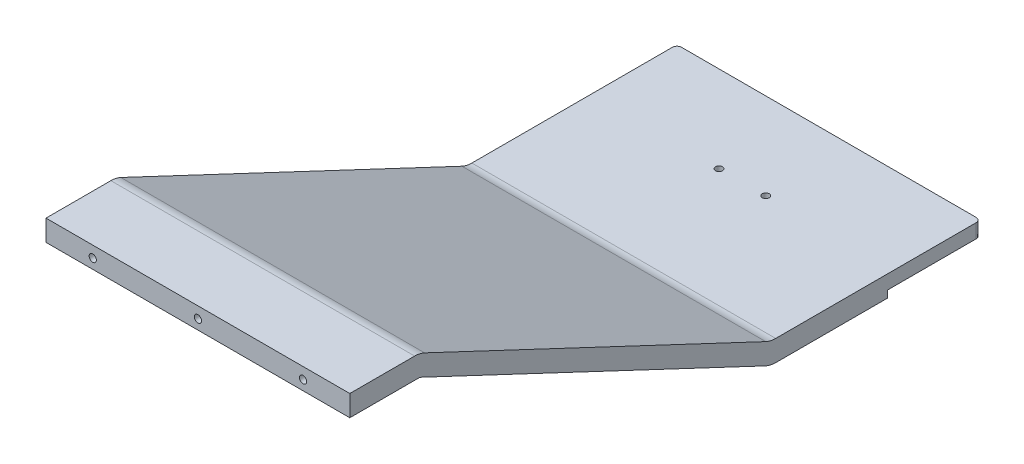
ISO-10303-21;
HEADER;
FILE_DESCRIPTION(('STEP AP214'),'2;1');
FILE_NAME('part.step','',(''),(''),'','','');
FILE_SCHEMA(('AUTOMOTIVE_DESIGN { 1 0 10303 214 1 1 1 1 }'));
ENDSEC;
DATA;
#1=APPLICATION_CONTEXT('core data for automotive mechanical design processes');
#2=APPLICATION_PROTOCOL_DEFINITION('international standard','automotive_design',2000,#1);
#3=PRODUCT_CONTEXT('',#1,'mechanical');
#4=PRODUCT('Part','Part','',(#3));
#5=PRODUCT_RELATED_PRODUCT_CATEGORY('part','',(#4));
#6=PRODUCT_DEFINITION_FORMATION('','',#4);
#7=PRODUCT_DEFINITION_CONTEXT('part definition',#1,'design');
#8=PRODUCT_DEFINITION('design','',#6,#7);
#9=PRODUCT_DEFINITION_SHAPE('','',#8);
#10=(LENGTH_UNIT() NAMED_UNIT(*) SI_UNIT(.MILLI.,.METRE.));
#11=(NAMED_UNIT(*) PLANE_ANGLE_UNIT() SI_UNIT($,.RADIAN.));
#12=(NAMED_UNIT(*) SI_UNIT($,.STERADIAN.) SOLID_ANGLE_UNIT());
#13=UNCERTAINTY_MEASURE_WITH_UNIT(LENGTH_MEASURE(1.E-05),#10,'distance_accuracy_value','');
#14=(GEOMETRIC_REPRESENTATION_CONTEXT(3) GLOBAL_UNCERTAINTY_ASSIGNED_CONTEXT((#13)) GLOBAL_UNIT_ASSIGNED_CONTEXT((#10,
#11,#12)) REPRESENTATION_CONTEXT('',''));
#15=CARTESIAN_POINT('',(0.,0.,0.));
#16=DIRECTION('',(0.,0.,1.));
#17=DIRECTION('',(1.,0.,0.));
#18=AXIS2_PLACEMENT_3D('',#15,#16,#17);
#19=CARTESIAN_POINT('',(209.,70.,-50.));
#20=DIRECTION('',(0.,0.,1.));
#21=DIRECTION('',(1.,0.,0.));
#22=AXIS2_PLACEMENT_3D('',#19,#20,#21);
#23=PLANE('',#22);
#24=DIRECTION('',(0.,1.,0.));
#25=VECTOR('',#24,1.);
#26=CARTESIAN_POINT('',(79.,70.,-50.));
#27=LINE('',#26,#25);
#28=CARTESIAN_POINT('',(79.,70.,-50.));
#29=VERTEX_POINT('',#28);
#30=CARTESIAN_POINT('',(79.,73.,-50.));
#31=VERTEX_POINT('',#30);
#32=EDGE_CURVE('E190',#29,#31,#27,.T.);
#33=ORIENTED_EDGE('',*,*,#32,.T.);
#34=DIRECTION('',(-1.,0.,0.));
#35=VECTOR('',#34,1.);
#36=CARTESIAN_POINT('',(209.,73.,-50.));
#37=LINE('',#36,#35);
#38=CARTESIAN_POINT('',(209.,73.,-50.));
#39=VERTEX_POINT('',#38);
#40=EDGE_CURVE('E252',#39,#31,#37,.T.);
#41=ORIENTED_EDGE('',*,*,#40,.F.);
#42=DIRECTION('',(0.,1.,0.));
#43=VECTOR('',#42,1.);
#44=CARTESIAN_POINT('',(209.,70.,-50.));
#45=LINE('',#44,#43);
#46=CARTESIAN_POINT('',(209.,70.,-50.));
#47=VERTEX_POINT('',#46);
#48=EDGE_CURVE('E197',#47,#39,#45,.T.);
#49=ORIENTED_EDGE('',*,*,#48,.F.);
#50=DIRECTION('',(-1.,0.,0.));
#51=VECTOR('',#50,1.);
#52=CARTESIAN_POINT('',(209.,70.,-50.));
#53=LINE('',#52,#51);
#54=EDGE_CURVE('E214',#47,#29,#53,.T.);
#55=ORIENTED_EDGE('',*,*,#54,.T.);
#56=EDGE_LOOP('',(#33,#41,#49,#55));
#57=FACE_BOUND('',#56,.T.);
#58=ADVANCED_FACE('F57',(#57),#23,.F.);
#59=CARTESIAN_POINT('',(209.,73.,-50.));
#60=DIRECTION('',(0.,1.,0.));
#61=DIRECTION('',(0.,0.,1.));
#62=AXIS2_PLACEMENT_3D('',#59,#60,#61);
#63=PLANE('',#62);
#64=CARTESIAN_POINT('',(134.,73.,-53.));
#65=DIRECTION('',(0.,-1.,0.));
#66=DIRECTION('',(0.,0.,-1.));
#67=AXIS2_PLACEMENT_3D('',#64,#65,#66);
#68=CIRCLE('',#67,1.5);
#69=CARTESIAN_POINT('',(134.,73.,-54.5));
#70=VERTEX_POINT('',#69);
#71=EDGE_CURVE('E278',#70,#70,#68,.T.);
#72=ORIENTED_EDGE('',*,*,#71,.F.);
#73=EDGE_LOOP('',(#72));
#74=FACE_BOUND('',#73,.T.);
#75=CARTESIAN_POINT('',(154.,73.,-53.));
#76=DIRECTION('',(0.,-1.,0.));
#77=DIRECTION('',(0.,0.,-1.));
#78=AXIS2_PLACEMENT_3D('',#75,#76,#77);
#79=CIRCLE('',#78,1.5);
#80=CARTESIAN_POINT('',(154.,73.,-54.5));
#81=VERTEX_POINT('',#80);
#82=EDGE_CURVE('E557',#81,#81,#79,.T.);
#83=ORIENTED_EDGE('',*,*,#82,.F.);
#84=EDGE_LOOP('',(#83));
#85=FACE_BOUND('',#84,.T.);
#86=DIRECTION('',(-1.,0.,0.));
#87=VECTOR('',#86,1.);
#88=CARTESIAN_POINT('',(209.,73.,-90.));
#89=LINE('',#88,#87);
#90=CARTESIAN_POINT('',(207.,73.,-90.));
#91=VERTEX_POINT('',#90);
#92=CARTESIAN_POINT('',(81.,73.,-90.));
#93=VERTEX_POINT('',#92);
#94=EDGE_CURVE('E247',#91,#93,#89,.T.);
#95=ORIENTED_EDGE('',*,*,#94,.F.);
#96=CARTESIAN_POINT('',(207.,73.,-88.));
#97=DIRECTION('',(0.,1.,0.));
#98=DIRECTION('',(0.,0.,1.));
#99=AXIS2_PLACEMENT_3D('',#96,#97,#98);
#100=CIRCLE('',#99,2.);
#101=CARTESIAN_POINT('',(209.,73.,-88.));
#102=VERTEX_POINT('',#101);
#103=EDGE_CURVE('E266',#91,#102,#100,.F.);
#104=ORIENTED_EDGE('',*,*,#103,.T.);
#105=DIRECTION('',(0.,0.,-1.));
#106=VECTOR('',#105,1.);
#107=CARTESIAN_POINT('',(209.,73.,-50.));
#108=LINE('',#107,#106);
#109=EDGE_CURVE('E199',#39,#102,#108,.T.);
#110=ORIENTED_EDGE('',*,*,#109,.F.);
#111=ORIENTED_EDGE('',*,*,#40,.T.);
#112=DIRECTION('',(0.,0.,-1.));
#113=VECTOR('',#112,1.);
#114=CARTESIAN_POINT('',(79.,73.,-50.));
#115=LINE('',#114,#113);
#116=CARTESIAN_POINT('',(79.,73.,-88.));
#117=VERTEX_POINT('',#116);
#118=EDGE_CURVE('E188',#31,#117,#115,.T.);
#119=ORIENTED_EDGE('',*,*,#118,.T.);
#120=CARTESIAN_POINT('',(81.,73.,-88.));
#121=DIRECTION('',(0.,1.,0.));
#122=DIRECTION('',(0.,0.,1.));
#123=AXIS2_PLACEMENT_3D('',#120,#121,#122);
#124=CIRCLE('',#123,2.);
#125=EDGE_CURVE('E268',#117,#93,#124,.F.);
#126=ORIENTED_EDGE('',*,*,#125,.T.);
#127=EDGE_LOOP('',(#95,#104,#110,#111,#119,#126));
#128=FACE_BOUND('',#127,.T.);
#129=ADVANCED_FACE('F321',(#74,#85,#128),#63,.F.);
#130=CARTESIAN_POINT('',(209.,73.,-90.));
#131=DIRECTION('',(0.,0.,1.));
#132=DIRECTION('',(1.,0.,0.));
#133=AXIS2_PLACEMENT_3D('',#130,#131,#132);
#134=PLANE('',#133);
#135=DIRECTION('',(-1.,0.,0.));
#136=VECTOR('',#135,1.);
#137=CARTESIAN_POINT('',(209.,79.,-90.));
#138=LINE('',#137,#136);
#139=CARTESIAN_POINT('',(207.,79.,-90.));
#140=VERTEX_POINT('',#139);
#141=CARTESIAN_POINT('',(81.,79.,-90.));
#142=VERTEX_POINT('',#141);
#143=EDGE_CURVE('E244',#140,#142,#138,.T.);
#144=ORIENTED_EDGE('',*,*,#143,.F.);
#145=DIRECTION('',(0.,1.,0.));
#146=VECTOR('',#145,1.);
#147=CARTESIAN_POINT('',(207.,73.,-90.));
#148=LINE('',#147,#146);
#149=EDGE_CURVE('E264',#140,#91,#148,.F.);
#150=ORIENTED_EDGE('',*,*,#149,.T.);
#151=ORIENTED_EDGE('',*,*,#94,.T.);
#152=DIRECTION('',(0.,1.,0.));
#153=VECTOR('',#152,1.);
#154=CARTESIAN_POINT('',(81.,73.,-90.));
#155=LINE('',#154,#153);
#156=EDGE_CURVE('E262',#93,#142,#155,.T.);
#157=ORIENTED_EDGE('',*,*,#156,.T.);
#158=EDGE_LOOP('',(#144,#150,#151,#157));
#159=FACE_BOUND('',#158,.T.);
#160=ADVANCED_FACE('F357',(#159),#134,.F.);
#161=CARTESIAN_POINT('',(209.,79.,-90.));
#162=DIRECTION('',(0.,-1.,0.));
#163=DIRECTION('',(0.,0.,-1.));
#164=AXIS2_PLACEMENT_3D('',#161,#162,#163);
#165=PLANE('',#164);
#166=CARTESIAN_POINT('',(134.,79.,-53.));
#167=DIRECTION('',(0.,-1.,0.));
#168=DIRECTION('',(0.,0.,-1.));
#169=AXIS2_PLACEMENT_3D('',#166,#167,#168);
#170=CIRCLE('',#169,1.5);
#171=CARTESIAN_POINT('',(134.,79.,-54.5));
#172=VERTEX_POINT('',#171);
#173=EDGE_CURVE('E273',#172,#172,#170,.T.);
#174=ORIENTED_EDGE('',*,*,#173,.T.);
#175=EDGE_LOOP('',(#174));
#176=FACE_BOUND('',#175,.T.);
#177=CARTESIAN_POINT('',(154.,79.,-53.));
#178=DIRECTION('',(0.,-1.,0.));
#179=DIRECTION('',(0.,0.,-1.));
#180=AXIS2_PLACEMENT_3D('',#177,#178,#179);
#181=CIRCLE('',#180,1.5);
#182=CARTESIAN_POINT('',(154.,79.,-54.5));
#183=VERTEX_POINT('',#182);
#184=EDGE_CURVE('E275',#183,#183,#181,.T.);
#185=ORIENTED_EDGE('',*,*,#184,.T.);
#186=EDGE_LOOP('',(#185));
#187=FACE_BOUND('',#186,.T.);
#188=DIRECTION('',(0.,0.,1.));
#189=VECTOR('',#188,1.);
#190=CARTESIAN_POINT('',(209.,79.,-90.));
#191=LINE('',#190,#189);
#192=CARTESIAN_POINT('',(209.,79.,-88.));
#193=VERTEX_POINT('',#192);
#194=CARTESIAN_POINT('',(209.,79.,-2.23887536352073));
#195=VERTEX_POINT('',#194);
#196=EDGE_CURVE('E201',#193,#195,#191,.T.);
#197=ORIENTED_EDGE('',*,*,#196,.F.);
#198=CARTESIAN_POINT('',(207.,79.,-88.));
#199=DIRECTION('',(0.,-1.,0.));
#200=DIRECTION('',(0.,0.,-1.));
#201=AXIS2_PLACEMENT_3D('',#198,#199,#200);
#202=CIRCLE('',#201,2.);
#203=EDGE_CURVE('E259',#193,#140,#202,.F.);
#204=ORIENTED_EDGE('',*,*,#203,.T.);
#205=ORIENTED_EDGE('',*,*,#143,.T.);
#206=CARTESIAN_POINT('',(81.,79.,-88.));
#207=DIRECTION('',(0.,-1.,0.));
#208=DIRECTION('',(0.,0.,-1.));
#209=AXIS2_PLACEMENT_3D('',#206,#207,#208);
#210=CIRCLE('',#209,2.);
#211=CARTESIAN_POINT('',(79.,79.,-88.));
#212=VERTEX_POINT('',#211);
#213=EDGE_CURVE('E260',#142,#212,#210,.F.);
#214=ORIENTED_EDGE('',*,*,#213,.T.);
#215=DIRECTION('',(0.,0.,1.));
#216=VECTOR('',#215,1.);
#217=CARTESIAN_POINT('',(79.,79.,-90.));
#218=LINE('',#217,#216);
#219=CARTESIAN_POINT('',(79.,79.,-2.23887536352073));
#220=VERTEX_POINT('',#219);
#221=EDGE_CURVE('E218',#212,#220,#218,.T.);
#222=ORIENTED_EDGE('',*,*,#221,.T.);
#223=DIRECTION('',(-1.,0.,0.));
#224=VECTOR('',#223,1.);
#225=CARTESIAN_POINT('',(209.,79.,-2.23887536352073));
#226=LINE('',#225,#224);
#227=EDGE_CURVE('E245',#195,#220,#226,.T.);
#228=ORIENTED_EDGE('',*,*,#227,.F.);
#229=EDGE_LOOP('',(#197,#204,#205,#214,#222,#228));
#230=FACE_BOUND('',#229,.T.);
#231=ADVANCED_FACE('F335',(#176,#187,#230),#165,.F.);
#232=CARTESIAN_POINT('',(209.,89.,-2.23887536352073));
#233=DIRECTION('',(-1.,0.,0.));
#234=DIRECTION('',(0.,0.,1.));
#235=AXIS2_PLACEMENT_3D('',#232,#233,#234);
#236=CYLINDRICAL_SURFACE('',#235,10.);
#237=CARTESIAN_POINT('',(79.,89.,-2.23887536352073));
#238=DIRECTION('',(-1.,0.,0.));
#239=DIRECTION('',(0.,0.,-1.));
#240=AXIS2_PLACEMENT_3D('',#237,#238,#239);
#241=CIRCLE('',#240,10.);
#242=CARTESIAN_POINT('',(79.,79.9546596626671,2.02513896359148));
#243=VERTEX_POINT('',#242);
#244=EDGE_CURVE('E216',#220,#243,#241,.T.);
#245=ORIENTED_EDGE('',*,*,#244,.T.);
#246=DIRECTION('',(-1.,0.,0.));
#247=VECTOR('',#246,1.);
#248=CARTESIAN_POINT('',(209.,79.9546596626671,2.02513896359148));
#249=LINE('',#248,#247);
#250=CARTESIAN_POINT('',(209.,79.9546596626671,2.02513896359148));
#251=VERTEX_POINT('',#250);
#252=EDGE_CURVE('E237',#251,#243,#249,.T.);
#253=ORIENTED_EDGE('',*,*,#252,.F.);
#254=CARTESIAN_POINT('',(209.,89.,-2.23887536352073));
#255=DIRECTION('',(-1.,0.,0.));
#256=DIRECTION('',(0.,0.,-1.));
#257=AXIS2_PLACEMENT_3D('',#254,#255,#256);
#258=CIRCLE('',#257,10.);
#259=EDGE_CURVE('E202',#195,#251,#258,.T.);
#260=ORIENTED_EDGE('',*,*,#259,.F.);
#261=ORIENTED_EDGE('',*,*,#227,.T.);
#262=EDGE_LOOP('',(#245,#253,#260,#261));
#263=FACE_BOUND('',#262,.T.);
#264=ADVANCED_FACE('F339',(#263),#236,.F.);
#265=CARTESIAN_POINT('',(209.,79.9546596626671,2.02513896359148));
#266=DIRECTION('',(0.,-0.904534033733291,0.42640143271122));
#267=DIRECTION('',(0.,-0.42640143271122,-0.904534033733291));
#268=AXIS2_PLACEMENT_3D('',#265,#266,#267);
#269=PLANE('',#268);
#270=DIRECTION('',(0.,0.42640143271122,0.904534033733291));
#271=VECTOR('',#270,1.);
#272=CARTESIAN_POINT('',(79.,79.9546596626671,2.02513896359148));
#273=LINE('',#272,#271);
#274=CARTESIAN_POINT('',(79.,148.756018455988,147.974861036408));
#275=VERTEX_POINT('',#274);
#276=EDGE_CURVE('E225',#243,#275,#273,.T.);
#277=ORIENTED_EDGE('',*,*,#276,.T.);
#278=DIRECTION('',(-1.,0.,0.));
#279=VECTOR('',#278,1.);
#280=CARTESIAN_POINT('',(209.,148.756018455988,147.974861036408));
#281=LINE('',#280,#279);
#282=CARTESIAN_POINT('',(209.,148.756018455988,147.974861036408));
#283=VERTEX_POINT('',#282);
#284=EDGE_CURVE('E64',#275,#283,#281,.F.);
#285=ORIENTED_EDGE('',*,*,#284,.T.);
#286=DIRECTION('',(0.,0.42640143271122,0.904534033733291));
#287=VECTOR('',#286,1.);
#288=CARTESIAN_POINT('',(209.,79.9546596626671,2.02513896359148));
#289=LINE('',#288,#287);
#290=EDGE_CURVE('E210',#251,#283,#289,.T.);
#291=ORIENTED_EDGE('',*,*,#290,.F.);
#292=ORIENTED_EDGE('',*,*,#252,.T.);
#293=EDGE_LOOP('',(#277,#285,#291,#292));
#294=FACE_BOUND('',#293,.T.);
#295=ADVANCED_FACE('F374',(#294),#269,.F.);
#296=CARTESIAN_POINT('',(209.,140.710678118655,150.));
#297=DIRECTION('',(0.,0.904534033733291,-0.42640143271122));
#298=DIRECTION('',(0.,0.42640143271122,0.904534033733291));
#299=AXIS2_PLACEMENT_3D('',#296,#297,#298);
#300=PLANE('',#299);
#301=DIRECTION('',(0.,-0.42640143271122,-0.904534033733291));
#302=VECTOR('',#301,1.);
#303=CARTESIAN_POINT('',(79.,140.710678118655,150.));
#304=LINE('',#303,#302);
#305=CARTESIAN_POINT('',(79.,140.710678118655,150.));
#306=VERTEX_POINT('',#305);
#307=CARTESIAN_POINT('',(79.,70.9546596626671,2.02513896359148));
#308=VERTEX_POINT('',#307);
#309=EDGE_CURVE('E223',#306,#308,#304,.T.);
#310=ORIENTED_EDGE('',*,*,#309,.T.);
#311=DIRECTION('',(-1.,0.,0.));
#312=VECTOR('',#311,1.);
#313=CARTESIAN_POINT('',(209.,70.9546596626671,2.02513896359148));
#314=LINE('',#313,#312);
#315=CARTESIAN_POINT('',(209.,70.9546596626671,2.02513896359148));
#316=VERTEX_POINT('',#315);
#317=EDGE_CURVE('E234',#316,#308,#314,.T.);
#318=ORIENTED_EDGE('',*,*,#317,.F.);
#319=DIRECTION('',(0.,-0.42640143271122,-0.904534033733291));
#320=VECTOR('',#319,1.);
#321=CARTESIAN_POINT('',(209.,140.710678118655,150.));
#322=LINE('',#321,#320);
#323=CARTESIAN_POINT('',(209.,140.710678118655,150.));
#324=VERTEX_POINT('',#323);
#325=EDGE_CURVE('E209',#324,#316,#322,.T.);
#326=ORIENTED_EDGE('',*,*,#325,.F.);
#327=DIRECTION('',(-1.,0.,0.));
#328=VECTOR('',#327,1.);
#329=CARTESIAN_POINT('',(209.,140.710678118655,150.));
#330=LINE('',#329,#328);
#331=EDGE_CURVE('E240',#324,#306,#330,.T.);
#332=ORIENTED_EDGE('',*,*,#331,.T.);
#333=EDGE_LOOP('',(#310,#318,#326,#332));
#334=FACE_BOUND('',#333,.T.);
#335=ADVANCED_FACE('F304',(#334),#300,.F.);
#336=CARTESIAN_POINT('',(209.,80.,-2.23887536352072));
#337=DIRECTION('',(-1.,0.,0.));
#338=DIRECTION('',(0.,0.,1.));
#339=AXIS2_PLACEMENT_3D('',#336,#337,#338);
#340=CYLINDRICAL_SURFACE('',#339,9.99999999999999);
#341=CARTESIAN_POINT('',(79.,80.,-2.23887536352072));
#342=DIRECTION('',(1.,0.,0.));
#343=DIRECTION('',(0.,0.,-1.));
#344=AXIS2_PLACEMENT_3D('',#341,#342,#343);
#345=CIRCLE('',#344,9.99999999999999);
#346=CARTESIAN_POINT('',(79.,70.,-2.23887536352072));
#347=VERTEX_POINT('',#346);
#348=EDGE_CURVE('E228',#308,#347,#345,.T.);
#349=ORIENTED_EDGE('',*,*,#348,.T.);
#350=DIRECTION('',(-1.,0.,0.));
#351=VECTOR('',#350,1.);
#352=CARTESIAN_POINT('',(209.,70.,-2.23887536352072));
#353=LINE('',#352,#351);
#354=CARTESIAN_POINT('',(209.,70.,-2.23887536352072));
#355=VERTEX_POINT('',#354);
#356=EDGE_CURVE('E233',#355,#347,#353,.T.);
#357=ORIENTED_EDGE('',*,*,#356,.F.);
#358=CARTESIAN_POINT('',(209.,80.,-2.23887536352072));
#359=DIRECTION('',(1.,0.,0.));
#360=DIRECTION('',(0.,0.,-1.));
#361=AXIS2_PLACEMENT_3D('',#358,#359,#360);
#362=CIRCLE('',#361,9.99999999999999);
#363=EDGE_CURVE('E213',#316,#355,#362,.T.);
#364=ORIENTED_EDGE('',*,*,#363,.F.);
#365=ORIENTED_EDGE('',*,*,#317,.T.);
#366=EDGE_LOOP('',(#349,#357,#364,#365));
#367=FACE_BOUND('',#366,.T.);
#368=ADVANCED_FACE('F311',(#367),#340,.T.);
#369=CARTESIAN_POINT('',(209.,70.,-2.23887536352072));
#370=DIRECTION('',(0.,1.,0.));
#371=DIRECTION('',(0.,0.,1.));
#372=AXIS2_PLACEMENT_3D('',#369,#370,#371);
#373=PLANE('',#372);
#374=DIRECTION('',(0.,0.,-1.));
#375=VECTOR('',#374,1.);
#376=CARTESIAN_POINT('',(79.,70.,-2.23887536352072));
#377=LINE('',#376,#375);
#378=EDGE_CURVE('E196',#347,#29,#377,.T.);
#379=ORIENTED_EDGE('',*,*,#378,.T.);
#380=ORIENTED_EDGE('',*,*,#54,.F.);
#381=DIRECTION('',(0.,0.,-1.));
#382=VECTOR('',#381,1.);
#383=CARTESIAN_POINT('',(209.,70.,-2.23887536352072));
#384=LINE('',#383,#382);
#385=EDGE_CURVE('E211',#355,#47,#384,.T.);
#386=ORIENTED_EDGE('',*,*,#385,.F.);
#387=ORIENTED_EDGE('',*,*,#356,.T.);
#388=EDGE_LOOP('',(#379,#380,#386,#387));
#389=FACE_BOUND('',#388,.T.);
#390=ADVANCED_FACE('F314',(#389),#373,.F.);
#391=CARTESIAN_POINT('',(209.,89.,-2.23887536352073));
#392=DIRECTION('',(1.,0.,0.));
#393=DIRECTION('',(0.,0.,-1.));
#394=AXIS2_PLACEMENT_3D('',#391,#392,#393);
#395=PLANE('',#394);
#396=ORIENTED_EDGE('',*,*,#290,.T.);
#397=CARTESIAN_POINT('',(209.,139.710678118655,152.238875363521));
#398=DIRECTION('',(1.,0.,0.));
#399=DIRECTION('',(0.,0.,-1.));
#400=AXIS2_PLACEMENT_3D('',#397,#398,#399);
#401=CIRCLE('',#400,10.);
#402=CARTESIAN_POINT('',(209.,149.710678118655,152.238875363521));
#403=VERTEX_POINT('',#402);
#404=EDGE_CURVE('E12',#283,#403,#401,.T.);
#405=ORIENTED_EDGE('',*,*,#404,.T.);
#406=DIRECTION('',(0.,0.,-1.));
#407=VECTOR('',#406,1.);
#408=CARTESIAN_POINT('',(209.,149.710678118655,180.));
#409=LINE('',#408,#407);
#410=CARTESIAN_POINT('',(209.,149.710678118655,180.));
#411=VERTEX_POINT('',#410);
#412=EDGE_CURVE('E294',#411,#403,#409,.T.);
#413=ORIENTED_EDGE('',*,*,#412,.F.);
#414=DIRECTION('',(0.,1.,0.));
#415=VECTOR('',#414,1.);
#416=CARTESIAN_POINT('',(209.,140.710678118655,180.));
#417=LINE('',#416,#415);
#418=CARTESIAN_POINT('',(209.,140.710678118655,180.));
#419=VERTEX_POINT('',#418);
#420=EDGE_CURVE('E180',#419,#411,#417,.T.);
#421=ORIENTED_EDGE('',*,*,#420,.F.);
#422=DIRECTION('',(0.,0.,-1.));
#423=VECTOR('',#422,1.);
#424=CARTESIAN_POINT('',(209.,140.710678118655,180.));
#425=LINE('',#424,#423);
#426=EDGE_CURVE('E195',#419,#324,#425,.T.);
#427=ORIENTED_EDGE('',*,*,#426,.T.);
#428=ORIENTED_EDGE('',*,*,#325,.T.);
#429=ORIENTED_EDGE('',*,*,#363,.T.);
#430=ORIENTED_EDGE('',*,*,#385,.T.);
#431=ORIENTED_EDGE('',*,*,#48,.T.);
#432=ORIENTED_EDGE('',*,*,#109,.T.);
#433=DIRECTION('',(0.,1.,0.));
#434=VECTOR('',#433,1.);
#435=CARTESIAN_POINT('',(209.,79.,-88.));
#436=LINE('',#435,#434);
#437=EDGE_CURVE('E251',#102,#193,#436,.T.);
#438=ORIENTED_EDGE('',*,*,#437,.T.);
#439=ORIENTED_EDGE('',*,*,#196,.T.);
#440=ORIENTED_EDGE('',*,*,#259,.T.);
#441=EDGE_LOOP('',(#396,#405,#413,#421,#427,#428,#429,#430,#431,#432,#438,#439,#440));
#442=FACE_BOUND('',#441,.T.);
#443=ADVANCED_FACE('F299',(#442),#395,.T.);
#444=CARTESIAN_POINT('',(79.,89.,-2.23887536352073));
#445=DIRECTION('',(1.,0.,0.));
#446=DIRECTION('',(0.,0.,-1.));
#447=AXIS2_PLACEMENT_3D('',#444,#445,#446);
#448=PLANE('',#447);
#449=DIRECTION('',(0.,0.,-1.));
#450=VECTOR('',#449,1.);
#451=CARTESIAN_POINT('',(79.,149.710678118655,180.));
#452=LINE('',#451,#450);
#453=CARTESIAN_POINT('',(79.,149.710678118655,180.));
#454=VERTEX_POINT('',#453);
#455=CARTESIAN_POINT('',(79.,149.710678118655,152.238875363521));
#456=VERTEX_POINT('',#455);
#457=EDGE_CURVE('E164',#454,#456,#452,.T.);
#458=ORIENTED_EDGE('',*,*,#457,.T.);
#459=CARTESIAN_POINT('',(79.,139.710678118655,152.238875363521));
#460=DIRECTION('',(1.,0.,0.));
#461=DIRECTION('',(0.,0.,-1.));
#462=AXIS2_PLACEMENT_3D('',#459,#460,#461);
#463=CIRCLE('',#462,10.);
#464=EDGE_CURVE('E76',#456,#275,#463,.F.);
#465=ORIENTED_EDGE('',*,*,#464,.T.);
#466=ORIENTED_EDGE('',*,*,#276,.F.);
#467=ORIENTED_EDGE('',*,*,#244,.F.);
#468=ORIENTED_EDGE('',*,*,#221,.F.);
#469=DIRECTION('',(0.,1.,0.));
#470=VECTOR('',#469,1.);
#471=CARTESIAN_POINT('',(79.,89.,-88.));
#472=LINE('',#471,#470);
#473=EDGE_CURVE('E267',#212,#117,#472,.F.);
#474=ORIENTED_EDGE('',*,*,#473,.T.);
#475=ORIENTED_EDGE('',*,*,#118,.F.);
#476=ORIENTED_EDGE('',*,*,#32,.F.);
#477=ORIENTED_EDGE('',*,*,#378,.F.);
#478=ORIENTED_EDGE('',*,*,#348,.F.);
#479=ORIENTED_EDGE('',*,*,#309,.F.);
#480=DIRECTION('',(0.,0.,-1.));
#481=VECTOR('',#480,1.);
#482=CARTESIAN_POINT('',(79.,140.710678118655,180.));
#483=LINE('',#482,#481);
#484=CARTESIAN_POINT('',(79.,140.710678118655,180.));
#485=VERTEX_POINT('',#484);
#486=EDGE_CURVE('E166',#485,#306,#483,.T.);
#487=ORIENTED_EDGE('',*,*,#486,.F.);
#488=DIRECTION('',(0.,-1.,0.));
#489=VECTOR('',#488,1.);
#490=CARTESIAN_POINT('',(79.,149.710678118655,180.));
#491=LINE('',#490,#489);
#492=EDGE_CURVE('E163',#454,#485,#491,.T.);
#493=ORIENTED_EDGE('',*,*,#492,.F.);
#494=EDGE_LOOP('',(#458,#465,#466,#467,#468,#474,#475,#476,#477,#478,#479,#487,#493));
#495=FACE_BOUND('',#494,.T.);
#496=ADVANCED_FACE('F161',(#495),#448,.F.);
#497=CARTESIAN_POINT('',(209.,149.710678118655,180.));
#498=DIRECTION('',(0.,-1.,0.));
#499=DIRECTION('',(0.,0.,-1.));
#500=AXIS2_PLACEMENT_3D('',#497,#498,#499);
#501=PLANE('',#500);
#502=ORIENTED_EDGE('',*,*,#412,.T.);
#503=DIRECTION('',(-1.,0.,0.));
#504=VECTOR('',#503,1.);
#505=CARTESIAN_POINT('',(209.,149.710678118655,152.238875363521));
#506=LINE('',#505,#504);
#507=EDGE_CURVE('E187',#403,#456,#506,.T.);
#508=ORIENTED_EDGE('',*,*,#507,.T.);
#509=ORIENTED_EDGE('',*,*,#457,.F.);
#510=DIRECTION('',(-1.,0.,0.));
#511=VECTOR('',#510,1.);
#512=CARTESIAN_POINT('',(209.,149.710678118655,180.));
#513=LINE('',#512,#511);
#514=EDGE_CURVE('E175',#411,#454,#513,.T.);
#515=ORIENTED_EDGE('',*,*,#514,.F.);
#516=EDGE_LOOP('',(#502,#508,#509,#515));
#517=FACE_BOUND('',#516,.T.);
#518=ADVANCED_FACE('F183',(#517),#501,.F.);
#519=CARTESIAN_POINT('',(79.,140.710678118655,180.));
#520=DIRECTION('',(0.,1.,0.));
#521=DIRECTION('',(0.,0.,1.));
#522=AXIS2_PLACEMENT_3D('',#519,#520,#521);
#523=PLANE('',#522);
#524=ORIENTED_EDGE('',*,*,#331,.F.);
#525=ORIENTED_EDGE('',*,*,#426,.F.);
#526=DIRECTION('',(1.,0.,0.));
#527=VECTOR('',#526,1.);
#528=CARTESIAN_POINT('',(79.,140.710678118655,180.));
#529=LINE('',#528,#527);
#530=EDGE_CURVE('E171',#485,#419,#529,.T.);
#531=ORIENTED_EDGE('',*,*,#530,.F.);
#532=ORIENTED_EDGE('',*,*,#486,.T.);
#533=EDGE_LOOP('',(#524,#525,#531,#532));
#534=FACE_BOUND('',#533,.T.);
#535=ADVANCED_FACE('F303',(#534),#523,.F.);
#536=CARTESIAN_POINT('',(0.,0.,180.));
#537=DIRECTION('',(0.,0.,1.));
#538=DIRECTION('',(1.,0.,0.));
#539=AXIS2_PLACEMENT_3D('',#536,#537,#538);
#540=PLANE('',#539);
#541=CARTESIAN_POINT('',(99.,144.890678118655,180.));
#542=DIRECTION('',(0.,0.,1.));
#543=DIRECTION('',(1.,0.,0.));
#544=AXIS2_PLACEMENT_3D('',#541,#542,#543);
#545=CIRCLE('',#544,1.54999999999999);
#546=CARTESIAN_POINT('',(100.55,144.890678118655,180.));
#547=VERTEX_POINT('',#546);
#548=EDGE_CURVE('E555',#547,#547,#545,.T.);
#549=ORIENTED_EDGE('',*,*,#548,.F.);
#550=EDGE_LOOP('',(#549));
#551=FACE_BOUND('',#550,.T.);
#552=CARTESIAN_POINT('',(144.,144.890678118655,180.));
#553=DIRECTION('',(0.,0.,1.));
#554=DIRECTION('',(1.,0.,0.));
#555=AXIS2_PLACEMENT_3D('',#552,#553,#554);
#556=CIRCLE('',#555,1.54999999999999);
#557=CARTESIAN_POINT('',(145.55,144.890678118655,180.));
#558=VERTEX_POINT('',#557);
#559=EDGE_CURVE('E560',#558,#558,#556,.T.);
#560=ORIENTED_EDGE('',*,*,#559,.F.);
#561=EDGE_LOOP('',(#560));
#562=FACE_BOUND('',#561,.T.);
#563=CARTESIAN_POINT('',(189.,144.890678118655,180.));
#564=DIRECTION('',(0.,0.,1.));
#565=DIRECTION('',(1.,0.,0.));
#566=AXIS2_PLACEMENT_3D('',#563,#564,#565);
#567=CIRCLE('',#566,1.54999999999999);
#568=CARTESIAN_POINT('',(190.55,144.890678118655,180.));
#569=VERTEX_POINT('',#568);
#570=EDGE_CURVE('E284',#569,#569,#567,.T.);
#571=ORIENTED_EDGE('',*,*,#570,.F.);
#572=EDGE_LOOP('',(#571));
#573=FACE_BOUND('',#572,.T.);
#574=ORIENTED_EDGE('',*,*,#514,.T.);
#575=ORIENTED_EDGE('',*,*,#492,.T.);
#576=ORIENTED_EDGE('',*,*,#530,.T.);
#577=ORIENTED_EDGE('',*,*,#420,.T.);
#578=EDGE_LOOP('',(#574,#575,#576,#577));
#579=FACE_BOUND('',#578,.T.);
#580=ADVANCED_FACE('F174',(#551,#562,#573,#579),#540,.T.);
#581=CARTESIAN_POINT('',(189.,144.890678118655,175.));
#582=DIRECTION('',(0.,0.,1.));
#583=DIRECTION('',(1.,0.,0.));
#584=AXIS2_PLACEMENT_3D('',#581,#582,#583);
#585=CYLINDRICAL_SURFACE('',#584,1.54999999999999);
#586=CARTESIAN_POINT('',(189.,144.890678118655,175.));
#587=DIRECTION('',(0.,0.,1.));
#588=DIRECTION('',(1.,0.,0.));
#589=AXIS2_PLACEMENT_3D('',#586,#587,#588);
#590=CIRCLE('',#589,1.54999999999999);
#591=CARTESIAN_POINT('',(190.55,144.890678118655,175.));
#592=VERTEX_POINT('',#591);
#593=EDGE_CURVE('E279',#592,#592,#590,.T.);
#594=ORIENTED_EDGE('',*,*,#593,.F.);
#595=EDGE_LOOP('',(#594));
#596=FACE_BOUND('',#595,.T.);
#597=ORIENTED_EDGE('',*,*,#570,.T.);
#598=EDGE_LOOP('',(#597));
#599=FACE_BOUND('',#598,.T.);
#600=ADVANCED_FACE('F502',(#596,#599),#585,.F.);
#601=CARTESIAN_POINT('',(189.,144.890678118655,175.));
#602=DIRECTION('',(0.,0.,1.));
#603=DIRECTION('',(1.,0.,0.));
#604=AXIS2_PLACEMENT_3D('',#601,#602,#603);
#605=PLANE('',#604);
#606=ORIENTED_EDGE('',*,*,#593,.T.);
#607=EDGE_LOOP('',(#606));
#608=FACE_BOUND('',#607,.T.);
#609=ADVANCED_FACE('F514',(#608),#605,.T.);
#610=CARTESIAN_POINT('',(144.,144.890678118655,175.));
#611=DIRECTION('',(0.,0.,1.));
#612=DIRECTION('',(1.,0.,0.));
#613=AXIS2_PLACEMENT_3D('',#610,#611,#612);
#614=CYLINDRICAL_SURFACE('',#613,1.54999999999999);
#615=CARTESIAN_POINT('',(144.,144.890678118655,175.));
#616=DIRECTION('',(0.,0.,1.));
#617=DIRECTION('',(1.,0.,0.));
#618=AXIS2_PLACEMENT_3D('',#615,#616,#617);
#619=CIRCLE('',#618,1.54999999999999);
#620=CARTESIAN_POINT('',(145.55,144.890678118655,175.));
#621=VERTEX_POINT('',#620);
#622=EDGE_CURVE('E288',#621,#621,#619,.T.);
#623=ORIENTED_EDGE('',*,*,#622,.F.);
#624=EDGE_LOOP('',(#623));
#625=FACE_BOUND('',#624,.T.);
#626=ORIENTED_EDGE('',*,*,#559,.T.);
#627=EDGE_LOOP('',(#626));
#628=FACE_BOUND('',#627,.T.);
#629=ADVANCED_FACE('F525',(#625,#628),#614,.F.);
#630=CARTESIAN_POINT('',(144.,144.890678118655,175.));
#631=DIRECTION('',(0.,0.,1.));
#632=DIRECTION('',(1.,0.,0.));
#633=AXIS2_PLACEMENT_3D('',#630,#631,#632);
#634=PLANE('',#633);
#635=ORIENTED_EDGE('',*,*,#622,.T.);
#636=EDGE_LOOP('',(#635));
#637=FACE_BOUND('',#636,.T.);
#638=ADVANCED_FACE('F527',(#637),#634,.T.);
#639=CARTESIAN_POINT('',(99.,144.890678118655,175.));
#640=DIRECTION('',(0.,0.,1.));
#641=DIRECTION('',(1.,0.,0.));
#642=AXIS2_PLACEMENT_3D('',#639,#640,#641);
#643=CYLINDRICAL_SURFACE('',#642,1.54999999999999);
#644=CARTESIAN_POINT('',(99.,144.890678118655,175.));
#645=DIRECTION('',(0.,0.,1.));
#646=DIRECTION('',(1.,0.,0.));
#647=AXIS2_PLACEMENT_3D('',#644,#645,#646);
#648=CIRCLE('',#647,1.54999999999999);
#649=CARTESIAN_POINT('',(100.55,144.890678118655,175.));
#650=VERTEX_POINT('',#649);
#651=EDGE_CURVE('E181',#650,#650,#648,.T.);
#652=ORIENTED_EDGE('',*,*,#651,.F.);
#653=EDGE_LOOP('',(#652));
#654=FACE_BOUND('',#653,.T.);
#655=ORIENTED_EDGE('',*,*,#548,.T.);
#656=EDGE_LOOP('',(#655));
#657=FACE_BOUND('',#656,.T.);
#658=ADVANCED_FACE('F539',(#654,#657),#643,.F.);
#659=CARTESIAN_POINT('',(99.,144.890678118655,175.));
#660=DIRECTION('',(0.,0.,1.));
#661=DIRECTION('',(1.,0.,0.));
#662=AXIS2_PLACEMENT_3D('',#659,#660,#661);
#663=PLANE('',#662);
#664=ORIENTED_EDGE('',*,*,#651,.T.);
#665=EDGE_LOOP('',(#664));
#666=FACE_BOUND('',#665,.T.);
#667=ADVANCED_FACE('F364',(#666),#663,.T.);
#668=CARTESIAN_POINT('',(207.,89.,-88.));
#669=DIRECTION('',(0.,-1.,0.));
#670=DIRECTION('',(0.,0.,-1.));
#671=AXIS2_PLACEMENT_3D('',#668,#669,#670);
#672=CYLINDRICAL_SURFACE('',#671,2.);
#673=ORIENTED_EDGE('',*,*,#103,.F.);
#674=ORIENTED_EDGE('',*,*,#149,.F.);
#675=ORIENTED_EDGE('',*,*,#203,.F.);
#676=ORIENTED_EDGE('',*,*,#437,.F.);
#677=EDGE_LOOP('',(#673,#674,#675,#676));
#678=FACE_BOUND('',#677,.T.);
#679=ADVANCED_FACE('F328',(#678),#672,.T.);
#680=CARTESIAN_POINT('',(81.,73.,-88.));
#681=DIRECTION('',(0.,1.,0.));
#682=DIRECTION('',(0.,0.,1.));
#683=AXIS2_PLACEMENT_3D('',#680,#681,#682);
#684=CYLINDRICAL_SURFACE('',#683,2.);
#685=ORIENTED_EDGE('',*,*,#125,.F.);
#686=ORIENTED_EDGE('',*,*,#473,.F.);
#687=ORIENTED_EDGE('',*,*,#213,.F.);
#688=ORIENTED_EDGE('',*,*,#156,.F.);
#689=EDGE_LOOP('',(#685,#686,#687,#688));
#690=FACE_BOUND('',#689,.T.);
#691=ADVANCED_FACE('F361',(#690),#684,.T.);
#692=CARTESIAN_POINT('',(154.,149.710678118655,-53.));
#693=DIRECTION('',(0.,-1.,0.));
#694=DIRECTION('',(0.,0.,-1.));
#695=AXIS2_PLACEMENT_3D('',#692,#693,#694);
#696=CYLINDRICAL_SURFACE('',#695,1.5);
#697=CARTESIAN_POINT('',(154.,73.,-54.5));
#698=CARTESIAN_POINT('',(154.,73.0625,-54.5));
#699=CARTESIAN_POINT('',(154.,73.125,-54.5));
#700=CARTESIAN_POINT('',(154.,73.25,-54.5));
#701=CARTESIAN_POINT('',(154.,73.3125,-54.5));
#702=CARTESIAN_POINT('',(154.,73.4375,-54.5));
#703=CARTESIAN_POINT('',(154.,73.5,-54.5));
#704=CARTESIAN_POINT('',(154.,73.625,-54.5));
#705=CARTESIAN_POINT('',(154.,73.6875,-54.5));
#706=CARTESIAN_POINT('',(154.,73.8125,-54.5));
#707=CARTESIAN_POINT('',(154.,73.875,-54.5));
#708=CARTESIAN_POINT('',(154.,74.,-54.5));
#709=CARTESIAN_POINT('',(154.,74.0625,-54.5));
#710=CARTESIAN_POINT('',(154.,74.1875,-54.5));
#711=CARTESIAN_POINT('',(154.,74.25,-54.5));
#712=CARTESIAN_POINT('',(154.,74.375,-54.5));
#713=CARTESIAN_POINT('',(154.,74.4375,-54.5));
#714=CARTESIAN_POINT('',(154.,74.5625,-54.5));
#715=CARTESIAN_POINT('',(154.,74.625,-54.5));
#716=CARTESIAN_POINT('',(154.,74.75,-54.5));
#717=CARTESIAN_POINT('',(154.,74.8125,-54.5));
#718=CARTESIAN_POINT('',(154.,74.9375,-54.5));
#719=CARTESIAN_POINT('',(154.,75.,-54.5));
#720=CARTESIAN_POINT('',(154.,75.125,-54.5));
#721=CARTESIAN_POINT('',(154.,75.1875,-54.5));
#722=CARTESIAN_POINT('',(154.,75.3125,-54.5));
#723=CARTESIAN_POINT('',(154.,75.375,-54.5));
#724=CARTESIAN_POINT('',(154.,75.5,-54.5));
#725=CARTESIAN_POINT('',(154.,75.5625,-54.5));
#726=CARTESIAN_POINT('',(154.,75.6875,-54.5));
#727=CARTESIAN_POINT('',(154.,75.75,-54.5));
#728=CARTESIAN_POINT('',(154.,75.875,-54.5));
#729=CARTESIAN_POINT('',(154.,75.9375,-54.5));
#730=CARTESIAN_POINT('',(154.,76.0625,-54.5));
#731=CARTESIAN_POINT('',(154.,76.125,-54.5));
#732=CARTESIAN_POINT('',(154.,76.25,-54.5));
#733=CARTESIAN_POINT('',(154.,76.3125,-54.5));
#734=CARTESIAN_POINT('',(154.,76.4375,-54.5));
#735=CARTESIAN_POINT('',(154.,76.5,-54.5));
#736=CARTESIAN_POINT('',(154.,76.625,-54.5));
#737=CARTESIAN_POINT('',(154.,76.6875,-54.5));
#738=CARTESIAN_POINT('',(154.,76.8125,-54.5));
#739=CARTESIAN_POINT('',(154.,76.875,-54.5));
#740=CARTESIAN_POINT('',(154.,77.,-54.5));
#741=CARTESIAN_POINT('',(154.,77.0625,-54.5));
#742=CARTESIAN_POINT('',(154.,77.1875,-54.5));
#743=CARTESIAN_POINT('',(154.,77.25,-54.5));
#744=CARTESIAN_POINT('',(154.,77.375,-54.5));
#745=CARTESIAN_POINT('',(154.,77.4375,-54.5));
#746=CARTESIAN_POINT('',(154.,77.5625,-54.5));
#747=CARTESIAN_POINT('',(154.,77.625,-54.5));
#748=CARTESIAN_POINT('',(154.,77.75,-54.5));
#749=CARTESIAN_POINT('',(154.,77.8125,-54.5));
#750=CARTESIAN_POINT('',(154.,77.9375,-54.5));
#751=CARTESIAN_POINT('',(154.,78.,-54.5));
#752=CARTESIAN_POINT('',(154.,78.125,-54.5));
#753=CARTESIAN_POINT('',(154.,78.1875,-54.5));
#754=CARTESIAN_POINT('',(154.,78.3125,-54.5));
#755=CARTESIAN_POINT('',(154.,78.375,-54.5));
#756=CARTESIAN_POINT('',(154.,78.5,-54.5));
#757=CARTESIAN_POINT('',(154.,78.5625,-54.5));
#758=CARTESIAN_POINT('',(154.,78.6875,-54.5));
#759=CARTESIAN_POINT('',(154.,78.75,-54.5));
#760=CARTESIAN_POINT('',(154.,78.875,-54.5));
#761=CARTESIAN_POINT('',(154.,78.9375,-54.5));
#762=CARTESIAN_POINT('',(154.,79.,-54.5));
#763=B_SPLINE_CURVE_WITH_KNOTS('',3,(#697,#698,#699,#700,#701,#702,#703,#704,#705,#706,#707,
#708,#709,#710,#711,#712,#713,#714,#715,#716,#717,#718,#719,#720,#721,#722,#723,#724,#725,#726,
#727,#728,#729,#730,#731,#732,#733,#734,#735,#736,#737,#738,#739,#740,#741,#742,#743,#744,#745,
#746,#747,#748,#749,#750,#751,#752,#753,#754,#755,#756,#757,#758,#759,#760,#761,#762),
.UNSPECIFIED.,.F.,.F.,(4,2,2,2,2,2,2,2,2,2,2,2,2,2,2,2,2,2,2,2,2,2,2,2,2,2,2,2,2,2,2,2,4),(0.,
0.187500000000007,0.375,0.562500000000007,0.750000000000001,0.937500000000008,1.125,
1.31250000000001,1.5,1.68750000000001,1.87500000000002,2.06250000000001,2.25000000000002,
2.43750000000001,2.62500000000002,2.81250000000001,3.00000000000002,3.18750000000002,
3.37500000000002,3.56250000000002,3.75000000000002,3.93750000000002,4.12500000000002,
4.31250000000002,4.50000000000003,4.68750000000002,4.87500000000003,5.06250000000002,
5.25000000000003,5.43750000000003,5.62500000000003,5.81250000000003,6.00000000000003),.UNSPECIFIED.);
#764=EDGE_CURVE('BSEAM348',#81,#183,#763,.T.);
#765=ORIENTED_EDGE('',*,*,#82,.T.);
#766=ORIENTED_EDGE('',*,*,#184,.F.);
#767=ORIENTED_EDGE('',*,*,#764,.T.);
#768=ORIENTED_EDGE('',*,*,#764,.F.);
#769=EDGE_LOOP('',(#765,#767,#766,#768));
#770=FACE_BOUND('',#769,.T.);
#771=ADVANCED_FACE('F348',(#770),#696,.F.);
#772=CARTESIAN_POINT('',(134.,149.710678118655,-53.));
#773=DIRECTION('',(0.,-1.,0.));
#774=DIRECTION('',(0.,0.,-1.));
#775=AXIS2_PLACEMENT_3D('',#772,#773,#774);
#776=CYLINDRICAL_SURFACE('',#775,1.5);
#777=CARTESIAN_POINT('',(134.,73.,-54.5));
#778=CARTESIAN_POINT('',(134.,73.0625,-54.5));
#779=CARTESIAN_POINT('',(134.,73.125,-54.5));
#780=CARTESIAN_POINT('',(134.,73.25,-54.5));
#781=CARTESIAN_POINT('',(134.,73.3125,-54.5));
#782=CARTESIAN_POINT('',(134.,73.4375,-54.5));
#783=CARTESIAN_POINT('',(134.,73.5,-54.5));
#784=CARTESIAN_POINT('',(134.,73.625,-54.5));
#785=CARTESIAN_POINT('',(134.,73.6875,-54.5));
#786=CARTESIAN_POINT('',(134.,73.8125,-54.5));
#787=CARTESIAN_POINT('',(134.,73.875,-54.5));
#788=CARTESIAN_POINT('',(134.,74.,-54.5));
#789=CARTESIAN_POINT('',(134.,74.0625,-54.5));
#790=CARTESIAN_POINT('',(134.,74.1875,-54.5));
#791=CARTESIAN_POINT('',(134.,74.25,-54.5));
#792=CARTESIAN_POINT('',(134.,74.375,-54.5));
#793=CARTESIAN_POINT('',(134.,74.4375,-54.5));
#794=CARTESIAN_POINT('',(134.,74.5625,-54.5));
#795=CARTESIAN_POINT('',(134.,74.625,-54.5));
#796=CARTESIAN_POINT('',(134.,74.75,-54.5));
#797=CARTESIAN_POINT('',(134.,74.8125,-54.5));
#798=CARTESIAN_POINT('',(134.,74.9375,-54.5));
#799=CARTESIAN_POINT('',(134.,75.,-54.5));
#800=CARTESIAN_POINT('',(134.,75.125,-54.5));
#801=CARTESIAN_POINT('',(134.,75.1875,-54.5));
#802=CARTESIAN_POINT('',(134.,75.3125,-54.5));
#803=CARTESIAN_POINT('',(134.,75.375,-54.5));
#804=CARTESIAN_POINT('',(134.,75.5,-54.5));
#805=CARTESIAN_POINT('',(134.,75.5625,-54.5));
#806=CARTESIAN_POINT('',(134.,75.6875,-54.5));
#807=CARTESIAN_POINT('',(134.,75.75,-54.5));
#808=CARTESIAN_POINT('',(134.,75.875,-54.5));
#809=CARTESIAN_POINT('',(134.,75.9375,-54.5));
#810=CARTESIAN_POINT('',(134.,76.0625,-54.5));
#811=CARTESIAN_POINT('',(134.,76.125,-54.5));
#812=CARTESIAN_POINT('',(134.,76.25,-54.5));
#813=CARTESIAN_POINT('',(134.,76.3125,-54.5));
#814=CARTESIAN_POINT('',(134.,76.4375,-54.5));
#815=CARTESIAN_POINT('',(134.,76.5,-54.5));
#816=CARTESIAN_POINT('',(134.,76.625,-54.5));
#817=CARTESIAN_POINT('',(134.,76.6875,-54.5));
#818=CARTESIAN_POINT('',(134.,76.8125,-54.5));
#819=CARTESIAN_POINT('',(134.,76.875,-54.5));
#820=CARTESIAN_POINT('',(134.,77.,-54.5));
#821=CARTESIAN_POINT('',(134.,77.0625,-54.5));
#822=CARTESIAN_POINT('',(134.,77.1875,-54.5));
#823=CARTESIAN_POINT('',(134.,77.25,-54.5));
#824=CARTESIAN_POINT('',(134.,77.375,-54.5));
#825=CARTESIAN_POINT('',(134.,77.4375,-54.5));
#826=CARTESIAN_POINT('',(134.,77.5625,-54.5));
#827=CARTESIAN_POINT('',(134.,77.625,-54.5));
#828=CARTESIAN_POINT('',(134.,77.75,-54.5));
#829=CARTESIAN_POINT('',(134.,77.8125,-54.5));
#830=CARTESIAN_POINT('',(134.,77.9375,-54.5));
#831=CARTESIAN_POINT('',(134.,78.,-54.5));
#832=CARTESIAN_POINT('',(134.,78.125,-54.5));
#833=CARTESIAN_POINT('',(134.,78.1875,-54.5));
#834=CARTESIAN_POINT('',(134.,78.3125,-54.5));
#835=CARTESIAN_POINT('',(134.,78.375,-54.5));
#836=CARTESIAN_POINT('',(134.,78.5,-54.5));
#837=CARTESIAN_POINT('',(134.,78.5625,-54.5));
#838=CARTESIAN_POINT('',(134.,78.6875,-54.5));
#839=CARTESIAN_POINT('',(134.,78.75,-54.5));
#840=CARTESIAN_POINT('',(134.,78.875,-54.5));
#841=CARTESIAN_POINT('',(134.,78.9375,-54.5));
#842=CARTESIAN_POINT('',(134.,79.,-54.5));
#843=B_SPLINE_CURVE_WITH_KNOTS('',3,(#777,#778,#779,#780,#781,#782,#783,#784,#785,#786,#787,
#788,#789,#790,#791,#792,#793,#794,#795,#796,#797,#798,#799,#800,#801,#802,#803,#804,#805,#806,
#807,#808,#809,#810,#811,#812,#813,#814,#815,#816,#817,#818,#819,#820,#821,#822,#823,#824,#825,
#826,#827,#828,#829,#830,#831,#832,#833,#834,#835,#836,#837,#838,#839,#840,#841,#842),
.UNSPECIFIED.,.F.,.F.,(4,2,2,2,2,2,2,2,2,2,2,2,2,2,2,2,2,2,2,2,2,2,2,2,2,2,2,2,2,2,2,2,4),(0.,
0.187500000000007,0.375,0.562500000000007,0.750000000000001,0.937500000000008,1.125,
1.31250000000001,1.5,1.68750000000001,1.87500000000002,2.06250000000001,2.25000000000002,
2.43750000000001,2.62500000000002,2.81250000000001,3.00000000000002,3.18750000000002,
3.37500000000002,3.56250000000002,3.75000000000002,3.93750000000002,4.12500000000002,
4.31250000000002,4.50000000000003,4.68750000000002,4.87500000000003,5.06250000000002,
5.25000000000003,5.43750000000003,5.62500000000003,5.81250000000003,6.00000000000003),.UNSPECIFIED.);
#844=EDGE_CURVE('BSEAM341',#70,#172,#843,.T.);
#845=ORIENTED_EDGE('',*,*,#71,.T.);
#846=ORIENTED_EDGE('',*,*,#173,.F.);
#847=ORIENTED_EDGE('',*,*,#844,.T.);
#848=ORIENTED_EDGE('',*,*,#844,.F.);
#849=EDGE_LOOP('',(#845,#847,#846,#848));
#850=FACE_BOUND('',#849,.T.);
#851=ADVANCED_FACE('F341',(#850),#776,.F.);
#852=CARTESIAN_POINT('',(209.,139.710678118655,152.238875363521));
#853=DIRECTION('',(-1.,0.,0.));
#854=DIRECTION('',(0.,0.,1.));
#855=AXIS2_PLACEMENT_3D('',#852,#853,#854);
#856=CYLINDRICAL_SURFACE('',#855,10.);
#857=ORIENTED_EDGE('',*,*,#404,.F.);
#858=ORIENTED_EDGE('',*,*,#284,.F.);
#859=ORIENTED_EDGE('',*,*,#464,.F.);
#860=ORIENTED_EDGE('',*,*,#507,.F.);
#861=EDGE_LOOP('',(#857,#858,#859,#860));
#862=FACE_BOUND('',#861,.T.);
#863=ADVANCED_FACE('F59',(#862),#856,.T.);
#864=CLOSED_SHELL('',(#58,#129,#160,#231,#264,#295,#335,#368,#390,#443,#496,#518,#535,#580,#600,
#609,#629,#638,#658,#667,#679,#691,#771,#851,#863));
#865=MANIFOLD_SOLID_BREP('B2',#864);
#866=ADVANCED_BREP_SHAPE_REPRESENTATION('',(#18,#865),#14);
#867=SHAPE_DEFINITION_REPRESENTATION(#9,#866);
ENDSEC;
END-ISO-10303-21;
